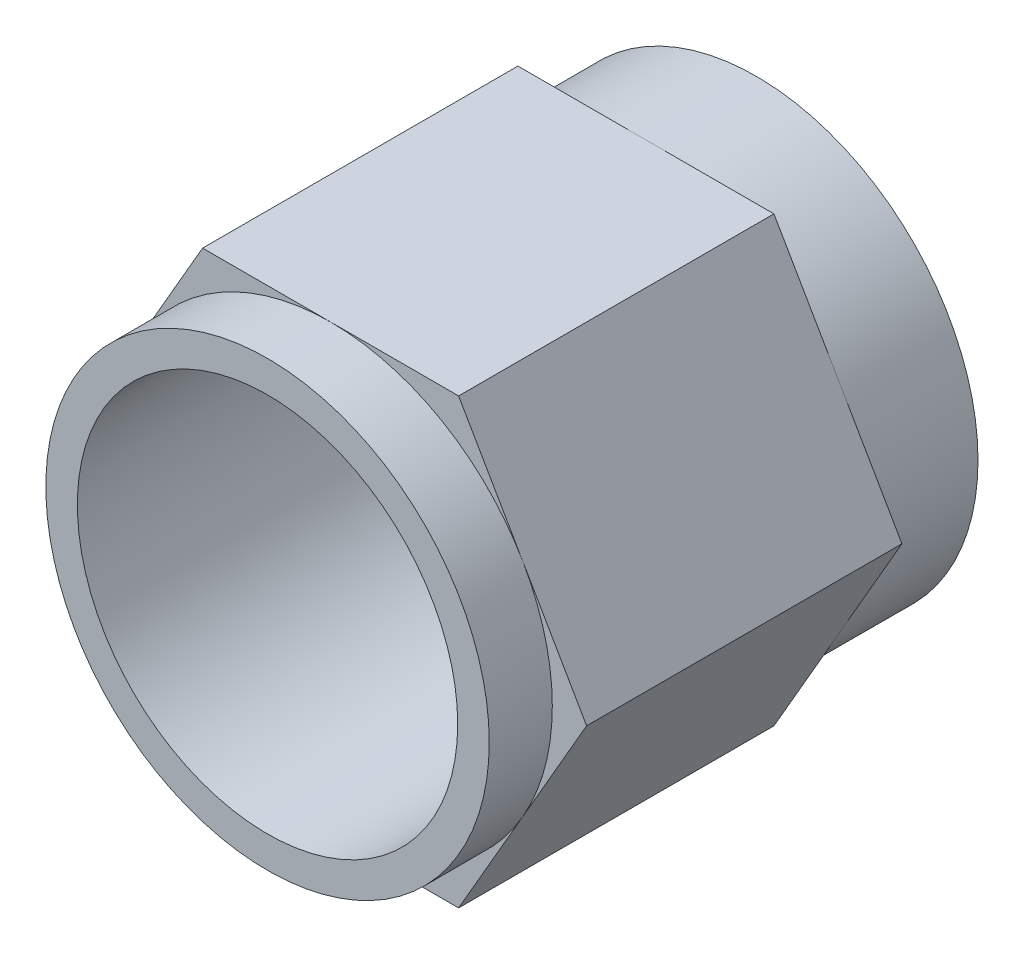
ISO-10303-21;
HEADER;
FILE_DESCRIPTION(('STEP AP214'),'2;1');
FILE_NAME('part.step','',(''),(''),'','','');
FILE_SCHEMA(('AUTOMOTIVE_DESIGN { 1 0 10303 214 1 1 1 1 }'));
ENDSEC;
DATA;
#1=APPLICATION_CONTEXT('core data for automotive mechanical design processes');
#2=APPLICATION_PROTOCOL_DEFINITION('international standard','automotive_design',2000,#1);
#3=PRODUCT_CONTEXT('',#1,'mechanical');
#4=PRODUCT('Part','Part','',(#3));
#5=PRODUCT_RELATED_PRODUCT_CATEGORY('part','',(#4));
#6=PRODUCT_DEFINITION_FORMATION('','',#4);
#7=PRODUCT_DEFINITION_CONTEXT('part definition',#1,'design');
#8=PRODUCT_DEFINITION('design','',#6,#7);
#9=PRODUCT_DEFINITION_SHAPE('','',#8);
#10=(LENGTH_UNIT() NAMED_UNIT(*) SI_UNIT(.MILLI.,.METRE.));
#11=(NAMED_UNIT(*) PLANE_ANGLE_UNIT() SI_UNIT($,.RADIAN.));
#12=(NAMED_UNIT(*) SI_UNIT($,.STERADIAN.) SOLID_ANGLE_UNIT());
#13=UNCERTAINTY_MEASURE_WITH_UNIT(LENGTH_MEASURE(1.E-05),#10,'distance_accuracy_value','');
#14=(GEOMETRIC_REPRESENTATION_CONTEXT(3) GLOBAL_UNCERTAINTY_ASSIGNED_CONTEXT((#13)) GLOBAL_UNIT_ASSIGNED_CONTEXT((#10,
#11,#12)) REPRESENTATION_CONTEXT('',''));
#15=CARTESIAN_POINT('',(0.,0.,0.));
#16=DIRECTION('',(0.,0.,1.));
#17=DIRECTION('',(1.,0.,0.));
#18=AXIS2_PLACEMENT_3D('',#15,#16,#17);
#19=CARTESIAN_POINT('',(9.90506454697134E-13,0.,288.75642993231));
#20=DIRECTION('',(0.,0.,1.));
#21=DIRECTION('',(1.,0.,0.));
#22=AXIS2_PLACEMENT_3D('',#19,#20,#21);
#23=CYLINDRICAL_SURFACE('',#22,7.14375000000002);
#24=CARTESIAN_POINT('',(0.,0.,0.));
#25=DIRECTION('',(0.,0.,1.));
#26=DIRECTION('',(1.,0.,0.));
#27=AXIS2_PLACEMENT_3D('',#24,#25,#26);
#28=CIRCLE('',#27,7.14375000000002);
#29=CARTESIAN_POINT('',(6.18666897828508,-3.571875,0.));
#30=VERTEX_POINT('',#29);
#31=CARTESIAN_POINT('',(6.18666897828508,3.571875,0.));
#32=VERTEX_POINT('',#31);
#33=EDGE_CURVE('E217',#30,#32,#28,.T.);
#34=ORIENTED_EDGE('',*,*,#33,.T.);
#35=CARTESIAN_POINT('',(0.,7.14375,0.));
#36=VERTEX_POINT('',#35);
#37=EDGE_CURVE('E237',#32,#36,#28,.T.);
#38=ORIENTED_EDGE('',*,*,#37,.T.);
#39=CARTESIAN_POINT('',(-6.18666897828508,3.571875,0.));
#40=VERTEX_POINT('',#39);
#41=EDGE_CURVE('E347',#36,#40,#28,.T.);
#42=ORIENTED_EDGE('',*,*,#41,.T.);
#43=CARTESIAN_POINT('',(-6.18666897828508,-3.571875,0.));
#44=VERTEX_POINT('',#43);
#45=EDGE_CURVE('E351',#40,#44,#28,.T.);
#46=ORIENTED_EDGE('',*,*,#45,.T.);
#47=CARTESIAN_POINT('',(0.,-7.14375,0.));
#48=VERTEX_POINT('',#47);
#49=EDGE_CURVE('E353',#44,#48,#28,.T.);
#50=ORIENTED_EDGE('',*,*,#49,.T.);
#51=EDGE_CURVE('E236',#48,#30,#28,.T.);
#52=ORIENTED_EDGE('',*,*,#51,.T.);
#53=EDGE_LOOP('',(#34,#38,#42,#46,#50,#52));
#54=FACE_BOUND('',#53,.T.);
#55=CARTESIAN_POINT('',(0.,0.,2.03199999999998));
#56=DIRECTION('',(0.,0.,1.));
#57=DIRECTION('',(1.,0.,0.));
#58=AXIS2_PLACEMENT_3D('',#55,#56,#57);
#59=CIRCLE('',#58,7.14374999999999);
#60=CARTESIAN_POINT('',(7.14375,0.,2.03199999999995));
#61=VERTEX_POINT('',#60);
#62=EDGE_CURVE('E242',#61,#61,#59,.T.);
#63=ORIENTED_EDGE('',*,*,#62,.F.);
#64=EDGE_LOOP('',(#63));
#65=FACE_BOUND('',#64,.T.);
#66=ADVANCED_FACE('F45',(#54,#65),#23,.T.);
#67=CARTESIAN_POINT('',(0.,0.,-12.7));
#68=DIRECTION('',(0.,0.,1.));
#69=DIRECTION('',(1.,0.,0.));
#70=AXIS2_PLACEMENT_3D('',#67,#68,#69);
#71=PLANE('',#70);
#72=CARTESIAN_POINT('',(0.,0.,-12.7));
#73=DIRECTION('',(0.,0.,1.));
#74=DIRECTION('',(1.,0.,0.));
#75=AXIS2_PLACEMENT_3D('',#72,#73,#74);
#76=CIRCLE('',#75,6.12775000000004);
#77=CARTESIAN_POINT('',(6.12775,0.,-12.7));
#78=VERTEX_POINT('',#77);
#79=EDGE_CURVE('E250',#78,#78,#76,.T.);
#80=ORIENTED_EDGE('',*,*,#79,.T.);
#81=EDGE_LOOP('',(#80));
#82=FACE_BOUND('',#81,.T.);
#83=ADVANCED_FACE('F278',(#82),#71,.T.);
#84=CARTESIAN_POINT('',(9.90506454697134E-13,0.,288.75642993231));
#85=DIRECTION('',(0.,0.,1.));
#86=DIRECTION('',(1.,0.,0.));
#87=AXIS2_PLACEMENT_3D('',#84,#85,#86);
#88=CYLINDRICAL_SURFACE('',#87,6.12775000000002);
#89=CARTESIAN_POINT('',(0.,0.,2.03199999999998));
#90=DIRECTION('',(0.,0.,1.));
#91=DIRECTION('',(1.,0.,0.));
#92=AXIS2_PLACEMENT_3D('',#89,#90,#91);
#93=CIRCLE('',#92,6.12774999999999);
#94=CARTESIAN_POINT('',(6.12775,0.,2.03199999999996));
#95=VERTEX_POINT('',#94);
#96=EDGE_CURVE('E246',#95,#95,#93,.T.);
#97=ORIENTED_EDGE('',*,*,#96,.T.);
#98=EDGE_LOOP('',(#97));
#99=FACE_BOUND('',#98,.T.);
#100=ORIENTED_EDGE('',*,*,#79,.F.);
#101=EDGE_LOOP('',(#100));
#102=FACE_BOUND('',#101,.T.);
#103=ADVANCED_FACE('F283',(#99,#102),#88,.F.);
#104=CARTESIAN_POINT('',(0.,0.,2.03200000000002));
#105=DIRECTION('',(0.,0.,-1.));
#106=DIRECTION('',(-1.,0.,0.));
#107=AXIS2_PLACEMENT_3D('',#104,#105,#106);
#108=PLANE('',#107);
#109=ORIENTED_EDGE('',*,*,#96,.F.);
#110=EDGE_LOOP('',(#109));
#111=FACE_BOUND('',#110,.T.);
#112=ORIENTED_EDGE('',*,*,#62,.T.);
#113=EDGE_LOOP('',(#112));
#114=FACE_BOUND('',#113,.T.);
#115=ADVANCED_FACE('F401',(#111,#114),#108,.F.);
#116=CARTESIAN_POINT('',(4.12444598552339,-7.14375,-10.16));
#117=DIRECTION('',(0.866025403784439,-0.5,0.));
#118=DIRECTION('',(0.5,0.866025403784439,0.));
#119=AXIS2_PLACEMENT_3D('',#116,#117,#118);
#120=PLANE('',#119);
#121=DIRECTION('',(0.5,0.866025403784439,0.));
#122=VECTOR('',#121,1.);
#123=CARTESIAN_POINT('',(4.12444598552339,-7.14375,0.));
#124=LINE('',#123,#122);
#125=CARTESIAN_POINT('',(8.24889197104678,0.,0.));
#126=VERTEX_POINT('',#125);
#127=EDGE_CURVE('E191',#30,#126,#124,.T.);
#128=ORIENTED_EDGE('',*,*,#127,.F.);
#129=CARTESIAN_POINT('',(4.12444598552339,-7.14375,0.));
#130=VERTEX_POINT('',#129);
#131=EDGE_CURVE('E186',#130,#30,#124,.T.);
#132=ORIENTED_EDGE('',*,*,#131,.F.);
#133=DIRECTION('',(0.,0.,1.));
#134=VECTOR('',#133,1.);
#135=CARTESIAN_POINT('',(4.12444598552339,-7.14375,-10.16));
#136=LINE('',#135,#134);
#137=CARTESIAN_POINT('',(4.12444598552339,-7.14375,-10.16));
#138=VERTEX_POINT('',#137);
#139=EDGE_CURVE('E213',#138,#130,#136,.T.);
#140=ORIENTED_EDGE('',*,*,#139,.F.);
#141=DIRECTION('',(0.5,0.866025403784439,0.));
#142=VECTOR('',#141,1.);
#143=CARTESIAN_POINT('',(4.12444598552339,-7.14375,-10.16));
#144=LINE('',#143,#142);
#145=CARTESIAN_POINT('',(6.18666897828508,-3.57187500000001,-10.16));
#146=VERTEX_POINT('',#145);
#147=EDGE_CURVE('E141',#138,#146,#144,.T.);
#148=ORIENTED_EDGE('',*,*,#147,.T.);
#149=CARTESIAN_POINT('',(8.24889197104678,0.,-10.16));
#150=VERTEX_POINT('',#149);
#151=EDGE_CURVE('E133',#146,#150,#144,.T.);
#152=ORIENTED_EDGE('',*,*,#151,.T.);
#153=DIRECTION('',(0.,0.,1.));
#154=VECTOR('',#153,1.);
#155=CARTESIAN_POINT('',(8.24889197104678,0.,-10.16));
#156=LINE('',#155,#154);
#157=EDGE_CURVE('E137',#150,#126,#156,.T.);
#158=ORIENTED_EDGE('',*,*,#157,.T.);
#159=EDGE_LOOP('',(#128,#132,#140,#148,#152,#158));
#160=FACE_BOUND('',#159,.T.);
#161=ADVANCED_FACE('F136',(#160),#120,.T.);
#162=CARTESIAN_POINT('',(-4.12444598552339,-7.14375,-10.16));
#163=DIRECTION('',(0.,-1.,0.));
#164=DIRECTION('',(1.,0.,0.));
#165=AXIS2_PLACEMENT_3D('',#162,#163,#164);
#166=PLANE('',#165);
#167=DIRECTION('',(1.,0.,0.));
#168=VECTOR('',#167,1.);
#169=CARTESIAN_POINT('',(-4.12444598552339,-7.14375,0.));
#170=LINE('',#169,#168);
#171=EDGE_CURVE('E209',#48,#130,#170,.T.);
#172=ORIENTED_EDGE('',*,*,#171,.F.);
#173=CARTESIAN_POINT('',(-4.12444598552339,-7.14375,0.));
#174=VERTEX_POINT('',#173);
#175=EDGE_CURVE('E146',#174,#48,#170,.T.);
#176=ORIENTED_EDGE('',*,*,#175,.F.);
#177=DIRECTION('',(0.,0.,1.));
#178=VECTOR('',#177,1.);
#179=CARTESIAN_POINT('',(-4.12444598552339,-7.14375,-10.16));
#180=LINE('',#179,#178);
#181=CARTESIAN_POINT('',(-4.12444598552339,-7.14375,-10.16));
#182=VERTEX_POINT('',#181);
#183=EDGE_CURVE('E218',#182,#174,#180,.T.);
#184=ORIENTED_EDGE('',*,*,#183,.F.);
#185=DIRECTION('',(1.,0.,0.));
#186=VECTOR('',#185,1.);
#187=CARTESIAN_POINT('',(-4.12444598552339,-7.14375,-10.16));
#188=LINE('',#187,#186);
#189=CARTESIAN_POINT('',(0.,-7.14375,-10.16));
#190=VERTEX_POINT('',#189);
#191=EDGE_CURVE('E156',#182,#190,#188,.T.);
#192=ORIENTED_EDGE('',*,*,#191,.T.);
#193=EDGE_CURVE('E182',#190,#138,#188,.T.);
#194=ORIENTED_EDGE('',*,*,#193,.T.);
#195=ORIENTED_EDGE('',*,*,#139,.T.);
#196=EDGE_LOOP('',(#172,#176,#184,#192,#194,#195));
#197=FACE_BOUND('',#196,.T.);
#198=ADVANCED_FACE('F318',(#197),#166,.T.);
#199=CARTESIAN_POINT('',(-8.24889197104678,0.,-10.16));
#200=DIRECTION('',(-0.866025403784439,-0.5,0.));
#201=DIRECTION('',(0.5,-0.866025403784439,0.));
#202=AXIS2_PLACEMENT_3D('',#199,#200,#201);
#203=PLANE('',#202);
#204=DIRECTION('',(0.5,-0.866025403784439,0.));
#205=VECTOR('',#204,1.);
#206=CARTESIAN_POINT('',(-8.24889197104678,0.,0.));
#207=LINE('',#206,#205);
#208=EDGE_CURVE('E204',#44,#174,#207,.T.);
#209=ORIENTED_EDGE('',*,*,#208,.F.);
#210=CARTESIAN_POINT('',(-8.24889197104678,0.,0.));
#211=VERTEX_POINT('',#210);
#212=EDGE_CURVE('E205',#211,#44,#207,.T.);
#213=ORIENTED_EDGE('',*,*,#212,.F.);
#214=DIRECTION('',(0.,0.,1.));
#215=VECTOR('',#214,1.);
#216=CARTESIAN_POINT('',(-8.24889197104678,0.,-10.16));
#217=LINE('',#216,#215);
#218=CARTESIAN_POINT('',(-8.24889197104678,0.,-10.16));
#219=VERTEX_POINT('',#218);
#220=EDGE_CURVE('E222',#219,#211,#217,.T.);
#221=ORIENTED_EDGE('',*,*,#220,.F.);
#222=DIRECTION('',(0.5,-0.866025403784439,0.));
#223=VECTOR('',#222,1.);
#224=CARTESIAN_POINT('',(-8.24889197104678,0.,-10.16));
#225=LINE('',#224,#223);
#226=CARTESIAN_POINT('',(-6.18666897828509,-3.57187499999999,-10.16));
#227=VERTEX_POINT('',#226);
#228=EDGE_CURVE('E178',#219,#227,#225,.T.);
#229=ORIENTED_EDGE('',*,*,#228,.T.);
#230=EDGE_CURVE('E177',#227,#182,#225,.T.);
#231=ORIENTED_EDGE('',*,*,#230,.T.);
#232=ORIENTED_EDGE('',*,*,#183,.T.);
#233=EDGE_LOOP('',(#209,#213,#221,#229,#231,#232));
#234=FACE_BOUND('',#233,.T.);
#235=ADVANCED_FACE('F325',(#234),#203,.T.);
#236=CARTESIAN_POINT('',(-4.12444598552339,7.14375,-10.16));
#237=DIRECTION('',(-0.866025403784439,0.5,0.));
#238=DIRECTION('',(-0.5,-0.866025403784439,0.));
#239=AXIS2_PLACEMENT_3D('',#236,#237,#238);
#240=PLANE('',#239);
#241=DIRECTION('',(-0.5,-0.866025403784439,0.));
#242=VECTOR('',#241,1.);
#243=CARTESIAN_POINT('',(-4.12444598552339,7.14375,0.));
#244=LINE('',#243,#242);
#245=EDGE_CURVE('E199',#40,#211,#244,.T.);
#246=ORIENTED_EDGE('',*,*,#245,.F.);
#247=CARTESIAN_POINT('',(-4.12444598552339,7.14375,0.));
#248=VERTEX_POINT('',#247);
#249=EDGE_CURVE('E200',#248,#40,#244,.T.);
#250=ORIENTED_EDGE('',*,*,#249,.F.);
#251=DIRECTION('',(0.,0.,1.));
#252=VECTOR('',#251,1.);
#253=CARTESIAN_POINT('',(-4.12444598552339,7.14375,-10.16));
#254=LINE('',#253,#252);
#255=CARTESIAN_POINT('',(-4.12444598552339,7.14375,-10.16));
#256=VERTEX_POINT('',#255);
#257=EDGE_CURVE('E226',#256,#248,#254,.T.);
#258=ORIENTED_EDGE('',*,*,#257,.F.);
#259=DIRECTION('',(-0.5,-0.866025403784439,0.));
#260=VECTOR('',#259,1.);
#261=CARTESIAN_POINT('',(-4.12444598552339,7.14375,-10.16));
#262=LINE('',#261,#260);
#263=CARTESIAN_POINT('',(-6.18666897828509,3.57187499999998,-10.16));
#264=VERTEX_POINT('',#263);
#265=EDGE_CURVE('E173',#256,#264,#262,.T.);
#266=ORIENTED_EDGE('',*,*,#265,.T.);
#267=EDGE_CURVE('E172',#264,#219,#262,.T.);
#268=ORIENTED_EDGE('',*,*,#267,.T.);
#269=ORIENTED_EDGE('',*,*,#220,.T.);
#270=EDGE_LOOP('',(#246,#250,#258,#266,#268,#269));
#271=FACE_BOUND('',#270,.T.);
#272=ADVANCED_FACE('F332',(#271),#240,.T.);
#273=CARTESIAN_POINT('',(4.12444598552339,7.14375,-10.16));
#274=DIRECTION('',(0.,1.,0.));
#275=DIRECTION('',(0.,0.,1.));
#276=AXIS2_PLACEMENT_3D('',#273,#274,#275);
#277=PLANE('',#276);
#278=DIRECTION('',(-1.,0.,0.));
#279=VECTOR('',#278,1.);
#280=CARTESIAN_POINT('',(4.12444598552339,7.14375,0.));
#281=LINE('',#280,#279);
#282=EDGE_CURVE('E194',#36,#248,#281,.T.);
#283=ORIENTED_EDGE('',*,*,#282,.F.);
#284=CARTESIAN_POINT('',(4.12444598552339,7.14375,0.));
#285=VERTEX_POINT('',#284);
#286=EDGE_CURVE('E195',#285,#36,#281,.T.);
#287=ORIENTED_EDGE('',*,*,#286,.F.);
#288=DIRECTION('',(0.,0.,1.));
#289=VECTOR('',#288,1.);
#290=CARTESIAN_POINT('',(4.12444598552339,7.14375,-10.16));
#291=LINE('',#290,#289);
#292=CARTESIAN_POINT('',(4.12444598552339,7.14375,-10.16));
#293=VERTEX_POINT('',#292);
#294=EDGE_CURVE('E155',#293,#285,#291,.T.);
#295=ORIENTED_EDGE('',*,*,#294,.F.);
#296=DIRECTION('',(-1.,0.,0.));
#297=VECTOR('',#296,1.);
#298=CARTESIAN_POINT('',(4.12444598552339,7.14375,-10.16));
#299=LINE('',#298,#297);
#300=CARTESIAN_POINT('',(0.,7.14375000000001,-10.16));
#301=VERTEX_POINT('',#300);
#302=EDGE_CURVE('E167',#293,#301,#299,.T.);
#303=ORIENTED_EDGE('',*,*,#302,.T.);
#304=EDGE_CURVE('E162',#301,#256,#299,.T.);
#305=ORIENTED_EDGE('',*,*,#304,.T.);
#306=ORIENTED_EDGE('',*,*,#257,.T.);
#307=EDGE_LOOP('',(#283,#287,#295,#303,#305,#306));
#308=FACE_BOUND('',#307,.T.);
#309=ADVANCED_FACE('F338',(#308),#277,.T.);
#310=CARTESIAN_POINT('',(8.24889197104678,0.,-10.16));
#311=DIRECTION('',(0.866025403784439,0.5,0.));
#312=DIRECTION('',(-0.5,0.866025403784439,0.));
#313=AXIS2_PLACEMENT_3D('',#310,#311,#312);
#314=PLANE('',#313);
#315=DIRECTION('',(-0.5,0.866025403784439,0.));
#316=VECTOR('',#315,1.);
#317=CARTESIAN_POINT('',(8.24889197104678,0.,0.));
#318=LINE('',#317,#316);
#319=EDGE_CURVE('E190',#32,#285,#318,.T.);
#320=ORIENTED_EDGE('',*,*,#319,.F.);
#321=EDGE_CURVE('E153',#126,#32,#318,.T.);
#322=ORIENTED_EDGE('',*,*,#321,.F.);
#323=ORIENTED_EDGE('',*,*,#157,.F.);
#324=DIRECTION('',(-0.5,0.866025403784439,0.));
#325=VECTOR('',#324,1.);
#326=CARTESIAN_POINT('',(8.24889197104678,0.,-10.16));
#327=LINE('',#326,#325);
#328=CARTESIAN_POINT('',(6.18666897828507,3.57187500000001,-10.16));
#329=VERTEX_POINT('',#328);
#330=EDGE_CURVE('E152',#150,#329,#327,.T.);
#331=ORIENTED_EDGE('',*,*,#330,.T.);
#332=EDGE_CURVE('E163',#329,#293,#327,.T.);
#333=ORIENTED_EDGE('',*,*,#332,.T.);
#334=ORIENTED_EDGE('',*,*,#294,.T.);
#335=EDGE_LOOP('',(#320,#322,#323,#331,#333,#334));
#336=FACE_BOUND('',#335,.T.);
#337=ADVANCED_FACE('F151',(#336),#314,.T.);
#338=CARTESIAN_POINT('',(0.,0.,-10.16));
#339=DIRECTION('',(0.,0.,1.));
#340=DIRECTION('',(1.,0.,0.));
#341=AXIS2_PLACEMENT_3D('',#338,#339,#340);
#342=PLANE('',#341);
#343=ORIENTED_EDGE('',*,*,#332,.F.);
#344=CARTESIAN_POINT('',(0.,0.,-10.16));
#345=DIRECTION('',(0.,0.,1.));
#346=DIRECTION('',(1.,0.,0.));
#347=AXIS2_PLACEMENT_3D('',#344,#345,#346);
#348=CIRCLE('',#347,7.14375000000002);
#349=EDGE_CURVE('E241',#329,#301,#348,.T.);
#350=ORIENTED_EDGE('',*,*,#349,.T.);
#351=ORIENTED_EDGE('',*,*,#302,.F.);
#352=EDGE_LOOP('',(#343,#350,#351));
#353=FACE_BOUND('',#352,.T.);
#354=ADVANCED_FACE('F340',(#353),#342,.F.);
#355=ORIENTED_EDGE('',*,*,#304,.F.);
#356=EDGE_CURVE('E294',#301,#264,#348,.T.);
#357=ORIENTED_EDGE('',*,*,#356,.T.);
#358=ORIENTED_EDGE('',*,*,#265,.F.);
#359=EDGE_LOOP('',(#355,#357,#358));
#360=FACE_BOUND('',#359,.T.);
#361=ADVANCED_FACE('F334',(#360),#342,.F.);
#362=ORIENTED_EDGE('',*,*,#267,.F.);
#363=EDGE_CURVE('E60',#264,#227,#348,.T.);
#364=ORIENTED_EDGE('',*,*,#363,.T.);
#365=ORIENTED_EDGE('',*,*,#228,.F.);
#366=EDGE_LOOP('',(#362,#364,#365));
#367=FACE_BOUND('',#366,.T.);
#368=ADVANCED_FACE('F327',(#367),#342,.F.);
#369=ORIENTED_EDGE('',*,*,#230,.F.);
#370=EDGE_CURVE('E65',#227,#190,#348,.T.);
#371=ORIENTED_EDGE('',*,*,#370,.T.);
#372=ORIENTED_EDGE('',*,*,#191,.F.);
#373=EDGE_LOOP('',(#369,#371,#372));
#374=FACE_BOUND('',#373,.T.);
#375=ADVANCED_FACE('F320',(#374),#342,.F.);
#376=ORIENTED_EDGE('',*,*,#193,.F.);
#377=EDGE_CURVE('E240',#190,#146,#348,.T.);
#378=ORIENTED_EDGE('',*,*,#377,.T.);
#379=ORIENTED_EDGE('',*,*,#147,.F.);
#380=EDGE_LOOP('',(#376,#378,#379));
#381=FACE_BOUND('',#380,.T.);
#382=ADVANCED_FACE('F313',(#381),#342,.F.);
#383=ORIENTED_EDGE('',*,*,#151,.F.);
#384=EDGE_CURVE('E159',#146,#329,#348,.T.);
#385=ORIENTED_EDGE('',*,*,#384,.T.);
#386=ORIENTED_EDGE('',*,*,#330,.F.);
#387=EDGE_LOOP('',(#383,#385,#386));
#388=FACE_BOUND('',#387,.T.);
#389=ADVANCED_FACE('F158',(#388),#342,.F.);
#390=CARTESIAN_POINT('',(0.,0.,0.));
#391=DIRECTION('',(0.,0.,1.));
#392=DIRECTION('',(1.,0.,0.));
#393=AXIS2_PLACEMENT_3D('',#390,#391,#392);
#394=PLANE('',#393);
#395=ORIENTED_EDGE('',*,*,#37,.F.);
#396=ORIENTED_EDGE('',*,*,#319,.T.);
#397=ORIENTED_EDGE('',*,*,#286,.T.);
#398=EDGE_LOOP('',(#395,#396,#397));
#399=FACE_BOUND('',#398,.T.);
#400=ADVANCED_FACE('F344',(#399),#394,.T.);
#401=ORIENTED_EDGE('',*,*,#41,.F.);
#402=ORIENTED_EDGE('',*,*,#282,.T.);
#403=ORIENTED_EDGE('',*,*,#249,.T.);
#404=EDGE_LOOP('',(#401,#402,#403));
#405=FACE_BOUND('',#404,.T.);
#406=ADVANCED_FACE('F377',(#405),#394,.T.);
#407=ORIENTED_EDGE('',*,*,#45,.F.);
#408=ORIENTED_EDGE('',*,*,#245,.T.);
#409=ORIENTED_EDGE('',*,*,#212,.T.);
#410=EDGE_LOOP('',(#407,#408,#409));
#411=FACE_BOUND('',#410,.T.);
#412=ADVANCED_FACE('F382',(#411),#394,.T.);
#413=ORIENTED_EDGE('',*,*,#49,.F.);
#414=ORIENTED_EDGE('',*,*,#208,.T.);
#415=ORIENTED_EDGE('',*,*,#175,.T.);
#416=EDGE_LOOP('',(#413,#414,#415));
#417=FACE_BOUND('',#416,.T.);
#418=ADVANCED_FACE('F362',(#417),#394,.T.);
#419=ORIENTED_EDGE('',*,*,#51,.F.);
#420=ORIENTED_EDGE('',*,*,#171,.T.);
#421=ORIENTED_EDGE('',*,*,#131,.T.);
#422=EDGE_LOOP('',(#419,#420,#421));
#423=FACE_BOUND('',#422,.T.);
#424=ADVANCED_FACE('F358',(#423),#394,.T.);
#425=ORIENTED_EDGE('',*,*,#33,.F.);
#426=ORIENTED_EDGE('',*,*,#127,.T.);
#427=ORIENTED_EDGE('',*,*,#321,.T.);
#428=EDGE_LOOP('',(#425,#426,#427));
#429=FACE_BOUND('',#428,.T.);
#430=ADVANCED_FACE('F274',(#429),#394,.T.);
#431=CARTESIAN_POINT('',(0.,0.,-14.478));
#432=DIRECTION('',(0.,0.,1.));
#433=DIRECTION('',(1.,0.,0.));
#434=AXIS2_PLACEMENT_3D('',#431,#432,#433);
#435=PLANE('',#434);
#436=CARTESIAN_POINT('',(0.,0.,-14.478));
#437=DIRECTION('',(0.,0.,1.));
#438=DIRECTION('',(1.,0.,0.));
#439=AXIS2_PLACEMENT_3D('',#436,#437,#438);
#440=CIRCLE('',#439,3.94594632755796);
#441=CARTESIAN_POINT('',(3.94594632755791,0.,-14.478));
#442=VERTEX_POINT('',#441);
#443=EDGE_CURVE('E254',#442,#442,#440,.T.);
#444=ORIENTED_EDGE('',*,*,#443,.F.);
#445=EDGE_LOOP('',(#444));
#446=FACE_BOUND('',#445,.T.);
#447=ADVANCED_FACE('F265',(#446),#435,.F.);
#448=CARTESIAN_POINT('',(9.90506454697134E-13,0.,288.75642993231));
#449=DIRECTION('',(0.,0.,1.));
#450=DIRECTION('',(1.,0.,0.));
#451=AXIS2_PLACEMENT_3D('',#448,#449,#450);
#452=CYLINDRICAL_SURFACE('',#451,3.94594632755796);
#453=ORIENTED_EDGE('',*,*,#443,.T.);
#454=EDGE_LOOP('',(#453));
#455=FACE_BOUND('',#454,.T.);
#456=CARTESIAN_POINT('',(0.,0.,-13.716));
#457=DIRECTION('',(0.,0.,1.));
#458=DIRECTION('',(1.,0.,0.));
#459=AXIS2_PLACEMENT_3D('',#456,#457,#458);
#460=CIRCLE('',#459,3.94594632755795);
#461=CARTESIAN_POINT('',(3.94594632755791,0.,-13.716));
#462=VERTEX_POINT('',#461);
#463=EDGE_CURVE('E53',#462,#462,#460,.T.);
#464=ORIENTED_EDGE('',*,*,#463,.F.);
#465=EDGE_LOOP('',(#464));
#466=FACE_BOUND('',#465,.T.);
#467=ADVANCED_FACE('F263',(#455,#466),#452,.T.);
#468=CARTESIAN_POINT('',(0.,0.,-13.716));
#469=DIRECTION('',(0.,0.,1.));
#470=DIRECTION('',(1.,0.,0.));
#471=AXIS2_PLACEMENT_3D('',#468,#469,#470);
#472=PLANE('',#471);
#473=CARTESIAN_POINT('',(0.,0.,-13.716));
#474=DIRECTION('',(0.,0.,1.));
#475=DIRECTION('',(1.,0.,0.));
#476=AXIS2_PLACEMENT_3D('',#473,#474,#475);
#477=CIRCLE('',#476,7.14375000000005);
#478=CARTESIAN_POINT('',(7.14375,0.,-13.716));
#479=VERTEX_POINT('',#478);
#480=EDGE_CURVE('E11',#479,#479,#477,.T.);
#481=ORIENTED_EDGE('',*,*,#480,.F.);
#482=EDGE_LOOP('',(#481));
#483=FACE_BOUND('',#482,.T.);
#484=ORIENTED_EDGE('',*,*,#463,.T.);
#485=EDGE_LOOP('',(#484));
#486=FACE_BOUND('',#485,.T.);
#487=ADVANCED_FACE('F261',(#483,#486),#472,.F.);
#488=ORIENTED_EDGE('',*,*,#480,.T.);
#489=EDGE_LOOP('',(#488));
#490=FACE_BOUND('',#489,.T.);
#491=ORIENTED_EDGE('',*,*,#349,.F.);
#492=ORIENTED_EDGE('',*,*,#384,.F.);
#493=ORIENTED_EDGE('',*,*,#377,.F.);
#494=ORIENTED_EDGE('',*,*,#370,.F.);
#495=ORIENTED_EDGE('',*,*,#363,.F.);
#496=ORIENTED_EDGE('',*,*,#356,.F.);
#497=EDGE_LOOP('',(#491,#492,#493,#494,#495,#496));
#498=FACE_BOUND('',#497,.T.);
#499=ADVANCED_FACE('F272',(#490,#498),#23,.T.);
#500=CLOSED_SHELL('',(#66,#83,#103,#115,#161,#198,#235,#272,#309,#337,#354,#361,#368,#375,#382,
#389,#400,#406,#412,#418,#424,#430,#447,#467,#487,#499));
#501=MANIFOLD_SOLID_BREP('B2',#500);
#502=ADVANCED_BREP_SHAPE_REPRESENTATION('',(#18,#501),#14);
#503=SHAPE_DEFINITION_REPRESENTATION(#9,#502);
ENDSEC;
END-ISO-10303-21;
